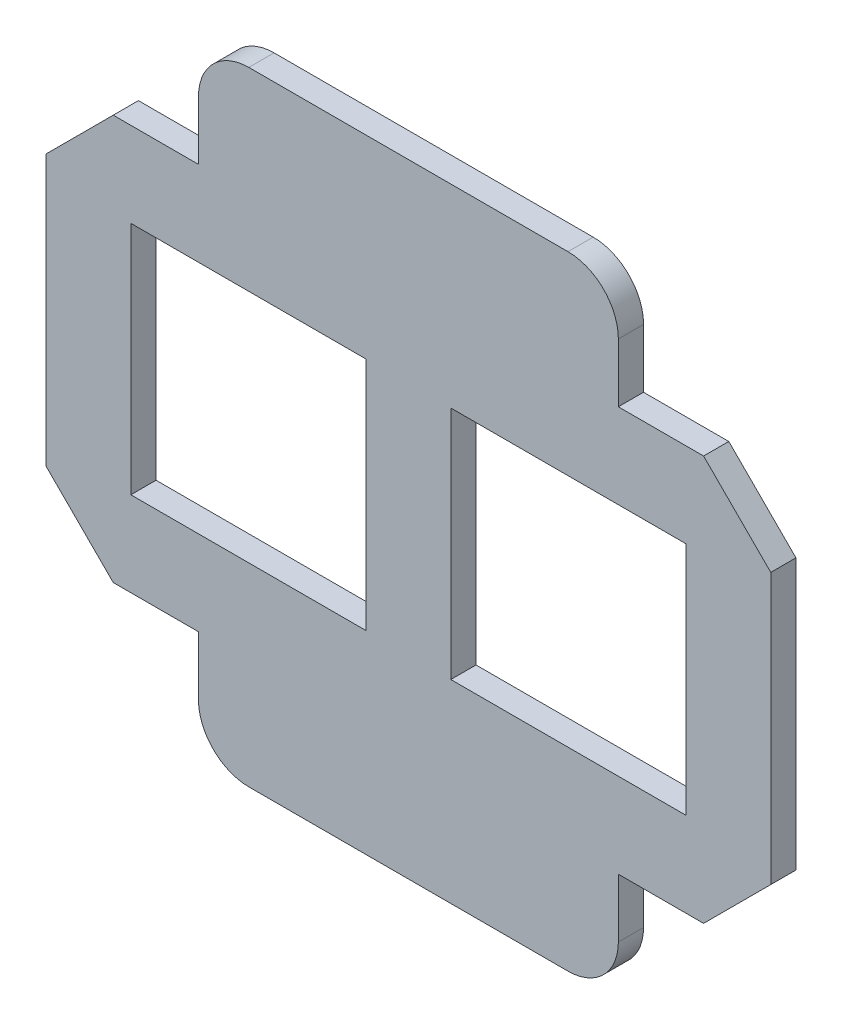
ISO-10303-21;
HEADER;
FILE_DESCRIPTION(('STEP AP214'),'2;1');
FILE_NAME('part.step','',(''),(''),'','','');
FILE_SCHEMA(('AUTOMOTIVE_DESIGN { 1 0 10303 214 1 1 1 1 }'));
ENDSEC;
DATA;
#1=APPLICATION_CONTEXT('core data for automotive mechanical design processes');
#2=APPLICATION_PROTOCOL_DEFINITION('international standard','automotive_design',2000,#1);
#3=PRODUCT_CONTEXT('',#1,'mechanical');
#4=PRODUCT('Part','Part','',(#3));
#5=PRODUCT_RELATED_PRODUCT_CATEGORY('part','',(#4));
#6=PRODUCT_DEFINITION_FORMATION('','',#4);
#7=PRODUCT_DEFINITION_CONTEXT('part definition',#1,'design');
#8=PRODUCT_DEFINITION('design','',#6,#7);
#9=PRODUCT_DEFINITION_SHAPE('','',#8);
#10=(LENGTH_UNIT() NAMED_UNIT(*) SI_UNIT(.MILLI.,.METRE.));
#11=(NAMED_UNIT(*) PLANE_ANGLE_UNIT() SI_UNIT($,.RADIAN.));
#12=(NAMED_UNIT(*) SI_UNIT($,.STERADIAN.) SOLID_ANGLE_UNIT());
#13=UNCERTAINTY_MEASURE_WITH_UNIT(LENGTH_MEASURE(1.E-05),#10,'distance_accuracy_value','');
#14=(GEOMETRIC_REPRESENTATION_CONTEXT(3) GLOBAL_UNCERTAINTY_ASSIGNED_CONTEXT((#13)) GLOBAL_UNIT_ASSIGNED_CONTEXT((#10,
#11,#12)) REPRESENTATION_CONTEXT('',''));
#15=CARTESIAN_POINT('',(0.,0.,0.));
#16=DIRECTION('',(0.,0.,1.));
#17=DIRECTION('',(1.,0.,0.));
#18=AXIS2_PLACEMENT_3D('',#15,#16,#17);
#19=CARTESIAN_POINT('',(14.,0.,1.5));
#20=DIRECTION('',(-1.,0.,0.));
#21=DIRECTION('',(0.,0.,1.));
#22=AXIS2_PLACEMENT_3D('',#19,#20,#21);
#23=PLANE('',#22);
#24=DIRECTION('',(0.,1.,0.));
#25=VECTOR('',#24,1.);
#26=CARTESIAN_POINT('',(14.,0.,0.));
#27=LINE('',#26,#25);
#28=CARTESIAN_POINT('',(14.,0.,0.));
#29=VERTEX_POINT('',#28);
#30=CARTESIAN_POINT('',(14.,14.,0.));
#31=VERTEX_POINT('',#30);
#32=EDGE_CURVE('E336',#29,#31,#27,.T.);
#33=ORIENTED_EDGE('',*,*,#32,.F.);
#34=DIRECTION('',(0.,0.,-1.));
#35=VECTOR('',#34,1.);
#36=CARTESIAN_POINT('',(14.,0.,1.5));
#37=LINE('',#36,#35);
#38=CARTESIAN_POINT('',(14.,0.,1.5));
#39=VERTEX_POINT('',#38);
#40=EDGE_CURVE('E356',#39,#29,#37,.T.);
#41=ORIENTED_EDGE('',*,*,#40,.F.);
#42=DIRECTION('',(0.,1.,0.));
#43=VECTOR('',#42,1.);
#44=CARTESIAN_POINT('',(14.,0.,1.5));
#45=LINE('',#44,#43);
#46=CARTESIAN_POINT('',(14.,14.,1.5));
#47=VERTEX_POINT('',#46);
#48=EDGE_CURVE('E286',#39,#47,#45,.T.);
#49=ORIENTED_EDGE('',*,*,#48,.T.);
#50=DIRECTION('',(0.,0.,-1.));
#51=VECTOR('',#50,1.);
#52=CARTESIAN_POINT('',(14.,14.,1.5));
#53=LINE('',#52,#51);
#54=EDGE_CURVE('E348',#47,#31,#53,.T.);
#55=ORIENTED_EDGE('',*,*,#54,.T.);
#56=EDGE_LOOP('',(#33,#41,#49,#55));
#57=FACE_BOUND('',#56,.T.);
#58=ADVANCED_FACE('F37',(#57),#23,.T.);
#59=CARTESIAN_POINT('',(0.,0.,1.5));
#60=DIRECTION('',(0.,1.,0.));
#61=DIRECTION('',(0.,0.,1.));
#62=AXIS2_PLACEMENT_3D('',#59,#60,#61);
#63=PLANE('',#62);
#64=DIRECTION('',(1.,0.,0.));
#65=VECTOR('',#64,1.);
#66=CARTESIAN_POINT('',(0.,0.,0.));
#67=LINE('',#66,#65);
#68=CARTESIAN_POINT('',(0.,0.,0.));
#69=VERTEX_POINT('',#68);
#70=EDGE_CURVE('E339',#69,#29,#67,.T.);
#71=ORIENTED_EDGE('',*,*,#70,.F.);
#72=DIRECTION('',(0.,0.,-1.));
#73=VECTOR('',#72,1.);
#74=CARTESIAN_POINT('',(0.,0.,1.5));
#75=LINE('',#74,#73);
#76=CARTESIAN_POINT('',(0.,0.,1.5));
#77=VERTEX_POINT('',#76);
#78=EDGE_CURVE('E354',#77,#69,#75,.T.);
#79=ORIENTED_EDGE('',*,*,#78,.F.);
#80=DIRECTION('',(1.,0.,0.));
#81=VECTOR('',#80,1.);
#82=CARTESIAN_POINT('',(0.,0.,1.5));
#83=LINE('',#82,#81);
#84=EDGE_CURVE('E289',#77,#39,#83,.T.);
#85=ORIENTED_EDGE('',*,*,#84,.T.);
#86=ORIENTED_EDGE('',*,*,#40,.T.);
#87=EDGE_LOOP('',(#71,#79,#85,#86));
#88=FACE_BOUND('',#87,.T.);
#89=ADVANCED_FACE('F518',(#88),#63,.T.);
#90=CARTESIAN_POINT('',(0.,0.,1.5));
#91=DIRECTION('',(-1.,0.,0.));
#92=DIRECTION('',(0.,0.,1.));
#93=AXIS2_PLACEMENT_3D('',#90,#91,#92);
#94=PLANE('',#93);
#95=DIRECTION('',(0.,1.,0.));
#96=VECTOR('',#95,1.);
#97=CARTESIAN_POINT('',(0.,0.,0.));
#98=LINE('',#97,#96);
#99=CARTESIAN_POINT('',(0.,14.,0.));
#100=VERTEX_POINT('',#99);
#101=EDGE_CURVE('E342',#69,#100,#98,.T.);
#102=ORIENTED_EDGE('',*,*,#101,.T.);
#103=DIRECTION('',(0.,0.,-1.));
#104=VECTOR('',#103,1.);
#105=CARTESIAN_POINT('',(0.,14.,1.5));
#106=LINE('',#105,#104);
#107=CARTESIAN_POINT('',(0.,14.,1.5));
#108=VERTEX_POINT('',#107);
#109=EDGE_CURVE('E350',#108,#100,#106,.T.);
#110=ORIENTED_EDGE('',*,*,#109,.F.);
#111=DIRECTION('',(0.,1.,0.));
#112=VECTOR('',#111,1.);
#113=CARTESIAN_POINT('',(0.,0.,1.5));
#114=LINE('',#113,#112);
#115=EDGE_CURVE('E292',#77,#108,#114,.T.);
#116=ORIENTED_EDGE('',*,*,#115,.F.);
#117=ORIENTED_EDGE('',*,*,#78,.T.);
#118=EDGE_LOOP('',(#102,#110,#116,#117));
#119=FACE_BOUND('',#118,.T.);
#120=ADVANCED_FACE('F524',(#119),#94,.F.);
#121=CARTESIAN_POINT('',(33.05,0.,1.5));
#122=DIRECTION('',(-1.,0.,0.));
#123=DIRECTION('',(0.,0.,1.));
#124=AXIS2_PLACEMENT_3D('',#121,#122,#123);
#125=PLANE('',#124);
#126=DIRECTION('',(0.,1.,0.));
#127=VECTOR('',#126,1.);
#128=CARTESIAN_POINT('',(33.05,0.,0.));
#129=LINE('',#128,#127);
#130=CARTESIAN_POINT('',(33.05,0.,0.));
#131=VERTEX_POINT('',#130);
#132=CARTESIAN_POINT('',(33.05,14.,0.));
#133=VERTEX_POINT('',#132);
#134=EDGE_CURVE('E324',#131,#133,#129,.T.);
#135=ORIENTED_EDGE('',*,*,#134,.F.);
#136=DIRECTION('',(0.,0.,-1.));
#137=VECTOR('',#136,1.);
#138=CARTESIAN_POINT('',(33.05,0.,1.5));
#139=LINE('',#138,#137);
#140=CARTESIAN_POINT('',(33.05,0.,1.5));
#141=VERTEX_POINT('',#140);
#142=EDGE_CURVE('E351',#141,#131,#139,.T.);
#143=ORIENTED_EDGE('',*,*,#142,.F.);
#144=DIRECTION('',(0.,1.,0.));
#145=VECTOR('',#144,1.);
#146=CARTESIAN_POINT('',(33.05,0.,1.5));
#147=LINE('',#146,#145);
#148=CARTESIAN_POINT('',(33.05,14.,1.5));
#149=VERTEX_POINT('',#148);
#150=EDGE_CURVE('E275',#141,#149,#147,.T.);
#151=ORIENTED_EDGE('',*,*,#150,.T.);
#152=DIRECTION('',(0.,0.,-1.));
#153=VECTOR('',#152,1.);
#154=CARTESIAN_POINT('',(33.05,14.,1.5));
#155=LINE('',#154,#153);
#156=EDGE_CURVE('E243',#149,#133,#155,.T.);
#157=ORIENTED_EDGE('',*,*,#156,.T.);
#158=EDGE_LOOP('',(#135,#143,#151,#157));
#159=FACE_BOUND('',#158,.T.);
#160=ADVANCED_FACE('F542',(#159),#125,.T.);
#161=CARTESIAN_POINT('',(0.,0.,1.5));
#162=DIRECTION('',(0.,1.,0.));
#163=DIRECTION('',(0.,0.,1.));
#164=AXIS2_PLACEMENT_3D('',#161,#162,#163);
#165=PLANE('',#164);
#166=DIRECTION('',(1.,0.,0.));
#167=VECTOR('',#166,1.);
#168=CARTESIAN_POINT('',(0.,0.,0.));
#169=LINE('',#168,#167);
#170=CARTESIAN_POINT('',(19.05,0.,0.));
#171=VERTEX_POINT('',#170);
#172=EDGE_CURVE('E327',#171,#131,#169,.T.);
#173=ORIENTED_EDGE('',*,*,#172,.F.);
#174=DIRECTION('',(0.,0.,-1.));
#175=VECTOR('',#174,1.);
#176=CARTESIAN_POINT('',(19.05,0.,1.5));
#177=LINE('',#176,#175);
#178=CARTESIAN_POINT('',(19.05,0.,1.5));
#179=VERTEX_POINT('',#178);
#180=EDGE_CURVE('E363',#179,#171,#177,.T.);
#181=ORIENTED_EDGE('',*,*,#180,.F.);
#182=DIRECTION('',(1.,0.,0.));
#183=VECTOR('',#182,1.);
#184=CARTESIAN_POINT('',(0.,0.,1.5));
#185=LINE('',#184,#183);
#186=EDGE_CURVE('E278',#179,#141,#185,.T.);
#187=ORIENTED_EDGE('',*,*,#186,.T.);
#188=ORIENTED_EDGE('',*,*,#142,.T.);
#189=EDGE_LOOP('',(#173,#181,#187,#188));
#190=FACE_BOUND('',#189,.T.);
#191=ADVANCED_FACE('F538',(#190),#165,.T.);
#192=CARTESIAN_POINT('',(19.05,0.,1.5));
#193=DIRECTION('',(-1.,0.,0.));
#194=DIRECTION('',(0.,0.,1.));
#195=AXIS2_PLACEMENT_3D('',#192,#193,#194);
#196=PLANE('',#195);
#197=DIRECTION('',(0.,1.,0.));
#198=VECTOR('',#197,1.);
#199=CARTESIAN_POINT('',(19.05,0.,0.));
#200=LINE('',#199,#198);
#201=CARTESIAN_POINT('',(19.05,14.,0.));
#202=VERTEX_POINT('',#201);
#203=EDGE_CURVE('E330',#171,#202,#200,.T.);
#204=ORIENTED_EDGE('',*,*,#203,.T.);
#205=DIRECTION('',(0.,0.,-1.));
#206=VECTOR('',#205,1.);
#207=CARTESIAN_POINT('',(19.05,14.,1.5));
#208=LINE('',#207,#206);
#209=CARTESIAN_POINT('',(19.05,14.,1.5));
#210=VERTEX_POINT('',#209);
#211=EDGE_CURVE('E360',#210,#202,#208,.T.);
#212=ORIENTED_EDGE('',*,*,#211,.F.);
#213=DIRECTION('',(0.,1.,0.));
#214=VECTOR('',#213,1.);
#215=CARTESIAN_POINT('',(19.05,0.,1.5));
#216=LINE('',#215,#214);
#217=EDGE_CURVE('E281',#179,#210,#216,.T.);
#218=ORIENTED_EDGE('',*,*,#217,.F.);
#219=ORIENTED_EDGE('',*,*,#180,.T.);
#220=EDGE_LOOP('',(#204,#212,#218,#219));
#221=FACE_BOUND('',#220,.T.);
#222=ADVANCED_FACE('F534',(#221),#196,.F.);
#223=CARTESIAN_POINT('',(29.025,0.,1.5));
#224=DIRECTION('',(1.,0.,0.));
#225=DIRECTION('',(0.,0.,-1.));
#226=AXIS2_PLACEMENT_3D('',#223,#224,#225);
#227=PLANE('',#226);
#228=DIRECTION('',(0.,-1.,0.));
#229=VECTOR('',#228,1.);
#230=CARTESIAN_POINT('',(29.025,0.,0.));
#231=LINE('',#230,#229);
#232=CARTESIAN_POINT('',(29.025,22.55,0.));
#233=VERTEX_POINT('',#232);
#234=CARTESIAN_POINT('',(29.025,19.05,0.));
#235=VERTEX_POINT('',#234);
#236=EDGE_CURVE('E298',#233,#235,#231,.T.);
#237=ORIENTED_EDGE('',*,*,#236,.F.);
#238=DIRECTION('',(0.,0.,-1.));
#239=VECTOR('',#238,1.);
#240=CARTESIAN_POINT('',(29.025,22.55,1.5));
#241=LINE('',#240,#239);
#242=CARTESIAN_POINT('',(29.025,22.55,1.5));
#243=VERTEX_POINT('',#242);
#244=EDGE_CURVE('E401',#233,#243,#241,.F.);
#245=ORIENTED_EDGE('',*,*,#244,.T.);
#246=DIRECTION('',(0.,-1.,0.));
#247=VECTOR('',#246,1.);
#248=CARTESIAN_POINT('',(29.025,0.,1.5));
#249=LINE('',#248,#247);
#250=CARTESIAN_POINT('',(29.025,19.05,1.5));
#251=VERTEX_POINT('',#250);
#252=EDGE_CURVE('E255',#243,#251,#249,.T.);
#253=ORIENTED_EDGE('',*,*,#252,.T.);
#254=DIRECTION('',(0.,0.,-1.));
#255=VECTOR('',#254,1.);
#256=CARTESIAN_POINT('',(29.025,19.05,1.5));
#257=LINE('',#256,#255);
#258=EDGE_CURVE('E297',#251,#235,#257,.T.);
#259=ORIENTED_EDGE('',*,*,#258,.T.);
#260=EDGE_LOOP('',(#237,#245,#253,#259));
#261=FACE_BOUND('',#260,.T.);
#262=ADVANCED_FACE('F537',(#261),#227,.T.);
#263=CARTESIAN_POINT('',(0.,25.55,1.5));
#264=DIRECTION('',(0.,1.,0.));
#265=DIRECTION('',(0.,0.,1.));
#266=AXIS2_PLACEMENT_3D('',#263,#264,#265);
#267=PLANE('',#266);
#268=DIRECTION('',(1.,0.,0.));
#269=VECTOR('',#268,1.);
#270=CARTESIAN_POINT('',(0.,25.55,1.5));
#271=LINE('',#270,#269);
#272=CARTESIAN_POINT('',(7.025,25.55,1.5));
#273=VERTEX_POINT('',#272);
#274=CARTESIAN_POINT('',(26.025,25.55,1.5));
#275=VERTEX_POINT('',#274);
#276=EDGE_CURVE('E252',#273,#275,#271,.T.);
#277=ORIENTED_EDGE('',*,*,#276,.T.);
#278=DIRECTION('',(0.,0.,-1.));
#279=VECTOR('',#278,1.);
#280=CARTESIAN_POINT('',(26.025,25.55,1.5));
#281=LINE('',#280,#279);
#282=CARTESIAN_POINT('',(26.025,25.55,0.));
#283=VERTEX_POINT('',#282);
#284=EDGE_CURVE('E398',#275,#283,#281,.T.);
#285=ORIENTED_EDGE('',*,*,#284,.T.);
#286=DIRECTION('',(1.,0.,0.));
#287=VECTOR('',#286,1.);
#288=CARTESIAN_POINT('',(0.,25.55,0.));
#289=LINE('',#288,#287);
#290=CARTESIAN_POINT('',(7.025,25.55,0.));
#291=VERTEX_POINT('',#290);
#292=EDGE_CURVE('E300',#291,#283,#289,.T.);
#293=ORIENTED_EDGE('',*,*,#292,.F.);
#294=DIRECTION('',(0.,0.,-1.));
#295=VECTOR('',#294,1.);
#296=CARTESIAN_POINT('',(7.025,25.55,1.5));
#297=LINE('',#296,#295);
#298=EDGE_CURVE('E396',#291,#273,#297,.F.);
#299=ORIENTED_EDGE('',*,*,#298,.T.);
#300=EDGE_LOOP('',(#277,#285,#293,#299));
#301=FACE_BOUND('',#300,.T.);
#302=ADVANCED_FACE('F504',(#301),#267,.T.);
#303=CARTESIAN_POINT('',(4.025,0.,1.5));
#304=DIRECTION('',(-1.,0.,0.));
#305=DIRECTION('',(0.,0.,1.));
#306=AXIS2_PLACEMENT_3D('',#303,#304,#305);
#307=PLANE('',#306);
#308=DIRECTION('',(0.,1.,0.));
#309=VECTOR('',#308,1.);
#310=CARTESIAN_POINT('',(4.025,0.,1.5));
#311=LINE('',#310,#309);
#312=CARTESIAN_POINT('',(4.025,19.05,1.5));
#313=VERTEX_POINT('',#312);
#314=CARTESIAN_POINT('',(4.025,22.55,1.5));
#315=VERTEX_POINT('',#314);
#316=EDGE_CURVE('E233',#313,#315,#311,.T.);
#317=ORIENTED_EDGE('',*,*,#316,.T.);
#318=DIRECTION('',(0.,0.,-1.));
#319=VECTOR('',#318,1.);
#320=CARTESIAN_POINT('',(4.025,22.55,1.5));
#321=LINE('',#320,#319);
#322=CARTESIAN_POINT('',(4.025,22.55,0.));
#323=VERTEX_POINT('',#322);
#324=EDGE_CURVE('E403',#315,#323,#321,.T.);
#325=ORIENTED_EDGE('',*,*,#324,.T.);
#326=DIRECTION('',(0.,1.,0.));
#327=VECTOR('',#326,1.);
#328=CARTESIAN_POINT('',(4.025,0.,0.));
#329=LINE('',#328,#327);
#330=CARTESIAN_POINT('',(4.025,19.05,0.));
#331=VERTEX_POINT('',#330);
#332=EDGE_CURVE('E242',#331,#323,#329,.T.);
#333=ORIENTED_EDGE('',*,*,#332,.F.);
#334=DIRECTION('',(0.,0.,-1.));
#335=VECTOR('',#334,1.);
#336=CARTESIAN_POINT('',(4.025,19.05,1.5));
#337=LINE('',#336,#335);
#338=EDGE_CURVE('E227',#313,#331,#337,.T.);
#339=ORIENTED_EDGE('',*,*,#338,.F.);
#340=EDGE_LOOP('',(#317,#325,#333,#339));
#341=FACE_BOUND('',#340,.T.);
#342=ADVANCED_FACE('F238',(#341),#307,.T.);
#343=CARTESIAN_POINT('',(0.,19.05,1.5));
#344=DIRECTION('',(0.,1.,0.));
#345=DIRECTION('',(0.,0.,1.));
#346=AXIS2_PLACEMENT_3D('',#343,#344,#345);
#347=PLANE('',#346);
#348=DIRECTION('',(1.,0.,0.));
#349=VECTOR('',#348,1.);
#350=CARTESIAN_POINT('',(0.,19.05,0.));
#351=LINE('',#350,#349);
#352=CARTESIAN_POINT('',(-1.04999999999999,19.05,0.));
#353=VERTEX_POINT('',#352);
#354=EDGE_CURVE('E304',#353,#331,#351,.T.);
#355=ORIENTED_EDGE('',*,*,#354,.F.);
#356=DIRECTION('',(0.,0.,1.));
#357=VECTOR('',#356,1.);
#358=CARTESIAN_POINT('',(-1.04999999999999,19.05,1.5));
#359=LINE('',#358,#357);
#360=CARTESIAN_POINT('',(-1.04999999999999,19.05,1.5));
#361=VERTEX_POINT('',#360);
#362=EDGE_CURVE('E11',#353,#361,#359,.T.);
#363=ORIENTED_EDGE('',*,*,#362,.T.);
#364=DIRECTION('',(1.,0.,0.));
#365=VECTOR('',#364,1.);
#366=CARTESIAN_POINT('',(0.,19.05,1.5));
#367=LINE('',#366,#365);
#368=EDGE_CURVE('E223',#361,#313,#367,.T.);
#369=ORIENTED_EDGE('',*,*,#368,.T.);
#370=ORIENTED_EDGE('',*,*,#338,.T.);
#371=EDGE_LOOP('',(#355,#363,#369,#370));
#372=FACE_BOUND('',#371,.T.);
#373=ADVANCED_FACE('F226',(#372),#347,.T.);
#374=CARTESIAN_POINT('',(-5.05,0.,1.5));
#375=DIRECTION('',(1.,0.,0.));
#376=DIRECTION('',(0.,1.,0.));
#377=AXIS2_PLACEMENT_3D('',#374,#375,#376);
#378=PLANE('',#377);
#379=DIRECTION('',(0.,-1.,0.));
#380=VECTOR('',#379,1.);
#381=CARTESIAN_POINT('',(-5.05,0.,0.));
#382=LINE('',#381,#380);
#383=CARTESIAN_POINT('',(-5.05,15.05,0.));
#384=VERTEX_POINT('',#383);
#385=CARTESIAN_POINT('',(-5.05,-1.04999999999999,0.));
#386=VERTEX_POINT('',#385);
#387=EDGE_CURVE('E306',#384,#386,#382,.T.);
#388=ORIENTED_EDGE('',*,*,#387,.T.);
#389=DIRECTION('',(0.,0.,1.));
#390=VECTOR('',#389,1.);
#391=CARTESIAN_POINT('',(-5.05,-1.04999999999999,1.5));
#392=LINE('',#391,#390);
#393=CARTESIAN_POINT('',(-5.05,-1.04999999999999,1.5));
#394=VERTEX_POINT('',#393);
#395=EDGE_CURVE('E46',#386,#394,#392,.T.);
#396=ORIENTED_EDGE('',*,*,#395,.T.);
#397=DIRECTION('',(0.,-1.,0.));
#398=VECTOR('',#397,1.);
#399=CARTESIAN_POINT('',(-5.05,0.,1.5));
#400=LINE('',#399,#398);
#401=CARTESIAN_POINT('',(-5.05,15.05,1.5));
#402=VERTEX_POINT('',#401);
#403=EDGE_CURVE('E232',#402,#394,#400,.T.);
#404=ORIENTED_EDGE('',*,*,#403,.F.);
#405=DIRECTION('',(0.,0.,-1.));
#406=VECTOR('',#405,1.);
#407=CARTESIAN_POINT('',(-5.05,15.05,0.));
#408=LINE('',#407,#406);
#409=EDGE_CURVE('E433',#402,#384,#408,.T.);
#410=ORIENTED_EDGE('',*,*,#409,.T.);
#411=EDGE_LOOP('',(#388,#396,#404,#410));
#412=FACE_BOUND('',#411,.T.);
#413=ADVANCED_FACE('F437',(#412),#378,.F.);
#414=CARTESIAN_POINT('',(0.,-5.05,1.5));
#415=DIRECTION('',(0.,1.,0.));
#416=DIRECTION('',(0.,0.,1.));
#417=AXIS2_PLACEMENT_3D('',#414,#415,#416);
#418=PLANE('',#417);
#419=DIRECTION('',(1.,0.,0.));
#420=VECTOR('',#419,1.);
#421=CARTESIAN_POINT('',(0.,-5.05,1.5));
#422=LINE('',#421,#420);
#423=CARTESIAN_POINT('',(-1.05,-5.05,1.5));
#424=VERTEX_POINT('',#423);
#425=CARTESIAN_POINT('',(4.025,-5.05,1.5));
#426=VERTEX_POINT('',#425);
#427=EDGE_CURVE('E260',#424,#426,#422,.T.);
#428=ORIENTED_EDGE('',*,*,#427,.F.);
#429=DIRECTION('',(0.,0.,-1.));
#430=VECTOR('',#429,1.);
#431=CARTESIAN_POINT('',(-1.05,-5.05,1.5));
#432=LINE('',#431,#430);
#433=CARTESIAN_POINT('',(-1.05,-5.05,0.));
#434=VERTEX_POINT('',#433);
#435=EDGE_CURVE('E430',#424,#434,#432,.T.);
#436=ORIENTED_EDGE('',*,*,#435,.T.);
#437=DIRECTION('',(1.,0.,0.));
#438=VECTOR('',#437,1.);
#439=CARTESIAN_POINT('',(0.,-5.05,0.));
#440=LINE('',#439,#438);
#441=CARTESIAN_POINT('',(4.025,-5.05,0.));
#442=VERTEX_POINT('',#441);
#443=EDGE_CURVE('E309',#434,#442,#440,.T.);
#444=ORIENTED_EDGE('',*,*,#443,.T.);
#445=DIRECTION('',(0.,0.,-1.));
#446=VECTOR('',#445,1.);
#447=CARTESIAN_POINT('',(4.025,-5.05,1.5));
#448=LINE('',#447,#446);
#449=EDGE_CURVE('E244',#426,#442,#448,.T.);
#450=ORIENTED_EDGE('',*,*,#449,.F.);
#451=EDGE_LOOP('',(#428,#436,#444,#450));
#452=FACE_BOUND('',#451,.T.);
#453=ADVANCED_FACE('F448',(#452),#418,.F.);
#454=CARTESIAN_POINT('',(4.025,0.,1.5));
#455=DIRECTION('',(1.,0.,0.));
#456=DIRECTION('',(0.,1.,0.));
#457=AXIS2_PLACEMENT_3D('',#454,#455,#456);
#458=PLANE('',#457);
#459=DIRECTION('',(0.,-1.,0.));
#460=VECTOR('',#459,1.);
#461=CARTESIAN_POINT('',(4.025,0.,0.));
#462=LINE('',#461,#460);
#463=CARTESIAN_POINT('',(4.025,-8.55,0.));
#464=VERTEX_POINT('',#463);
#465=EDGE_CURVE('E311',#442,#464,#462,.T.);
#466=ORIENTED_EDGE('',*,*,#465,.T.);
#467=DIRECTION('',(0.,0.,-1.));
#468=VECTOR('',#467,1.);
#469=CARTESIAN_POINT('',(4.025,-8.55,1.5));
#470=LINE('',#469,#468);
#471=CARTESIAN_POINT('',(4.025,-8.55,1.5));
#472=VERTEX_POINT('',#471);
#473=EDGE_CURVE('E384',#464,#472,#470,.F.);
#474=ORIENTED_EDGE('',*,*,#473,.T.);
#475=DIRECTION('',(0.,-1.,0.));
#476=VECTOR('',#475,1.);
#477=CARTESIAN_POINT('',(4.025,0.,1.5));
#478=LINE('',#477,#476);
#479=EDGE_CURVE('E262',#426,#472,#478,.T.);
#480=ORIENTED_EDGE('',*,*,#479,.F.);
#481=ORIENTED_EDGE('',*,*,#449,.T.);
#482=EDGE_LOOP('',(#466,#474,#480,#481));
#483=FACE_BOUND('',#482,.T.);
#484=ADVANCED_FACE('F559',(#483),#458,.F.);
#485=CARTESIAN_POINT('',(0.,-11.55,1.5));
#486=DIRECTION('',(0.,1.,0.));
#487=DIRECTION('',(0.,0.,1.));
#488=AXIS2_PLACEMENT_3D('',#485,#486,#487);
#489=PLANE('',#488);
#490=DIRECTION('',(1.,0.,0.));
#491=VECTOR('',#490,1.);
#492=CARTESIAN_POINT('',(0.,-11.55,1.5));
#493=LINE('',#492,#491);
#494=CARTESIAN_POINT('',(7.025,-11.55,1.5));
#495=VERTEX_POINT('',#494);
#496=CARTESIAN_POINT('',(26.025,-11.55,1.5));
#497=VERTEX_POINT('',#496);
#498=EDGE_CURVE('E266',#495,#497,#493,.T.);
#499=ORIENTED_EDGE('',*,*,#498,.F.);
#500=DIRECTION('',(0.,0.,-1.));
#501=VECTOR('',#500,1.);
#502=CARTESIAN_POINT('',(7.025,-11.55,1.5));
#503=LINE('',#502,#501);
#504=CARTESIAN_POINT('',(7.025,-11.55,0.));
#505=VERTEX_POINT('',#504);
#506=EDGE_CURVE('E373',#495,#505,#503,.T.);
#507=ORIENTED_EDGE('',*,*,#506,.T.);
#508=DIRECTION('',(1.,0.,0.));
#509=VECTOR('',#508,1.);
#510=CARTESIAN_POINT('',(0.,-11.55,0.));
#511=LINE('',#510,#509);
#512=CARTESIAN_POINT('',(26.025,-11.55,0.));
#513=VERTEX_POINT('',#512);
#514=EDGE_CURVE('E315',#505,#513,#511,.T.);
#515=ORIENTED_EDGE('',*,*,#514,.T.);
#516=DIRECTION('',(0.,0.,-1.));
#517=VECTOR('',#516,1.);
#518=CARTESIAN_POINT('',(26.025,-11.55,1.5));
#519=LINE('',#518,#517);
#520=EDGE_CURVE('E358',#513,#497,#519,.F.);
#521=ORIENTED_EDGE('',*,*,#520,.T.);
#522=EDGE_LOOP('',(#499,#507,#515,#521));
#523=FACE_BOUND('',#522,.T.);
#524=ADVANCED_FACE('F460',(#523),#489,.F.);
#525=CARTESIAN_POINT('',(29.025,0.,1.5));
#526=DIRECTION('',(1.,0.,0.));
#527=DIRECTION('',(0.,0.,-1.));
#528=AXIS2_PLACEMENT_3D('',#525,#526,#527);
#529=PLANE('',#528);
#530=DIRECTION('',(0.,-1.,0.));
#531=VECTOR('',#530,1.);
#532=CARTESIAN_POINT('',(29.025,0.,1.5));
#533=LINE('',#532,#531);
#534=CARTESIAN_POINT('',(29.025,-5.05,1.5));
#535=VERTEX_POINT('',#534);
#536=CARTESIAN_POINT('',(29.025,-8.55,1.5));
#537=VERTEX_POINT('',#536);
#538=EDGE_CURVE('E269',#535,#537,#533,.T.);
#539=ORIENTED_EDGE('',*,*,#538,.T.);
#540=DIRECTION('',(0.,0.,-1.));
#541=VECTOR('',#540,1.);
#542=CARTESIAN_POINT('',(29.025,-8.55,0.));
#543=LINE('',#542,#541);
#544=CARTESIAN_POINT('',(29.025,-8.55,0.));
#545=VERTEX_POINT('',#544);
#546=EDGE_CURVE('E393',#537,#545,#543,.T.);
#547=ORIENTED_EDGE('',*,*,#546,.T.);
#548=DIRECTION('',(0.,-1.,0.));
#549=VECTOR('',#548,1.);
#550=CARTESIAN_POINT('',(29.025,0.,0.));
#551=LINE('',#550,#549);
#552=CARTESIAN_POINT('',(29.025,-5.05,0.));
#553=VERTEX_POINT('',#552);
#554=EDGE_CURVE('E318',#553,#545,#551,.T.);
#555=ORIENTED_EDGE('',*,*,#554,.F.);
#556=DIRECTION('',(0.,0.,-1.));
#557=VECTOR('',#556,1.);
#558=CARTESIAN_POINT('',(29.025,-5.05,1.5));
#559=LINE('',#558,#557);
#560=EDGE_CURVE('E368',#535,#553,#559,.T.);
#561=ORIENTED_EDGE('',*,*,#560,.F.);
#562=EDGE_LOOP('',(#539,#547,#555,#561));
#563=FACE_BOUND('',#562,.T.);
#564=ADVANCED_FACE('F469',(#563),#529,.T.);
#565=CARTESIAN_POINT('',(34.1,-5.05,0.));
#566=VERTEX_POINT('',#565);
#567=EDGE_CURVE('E312',#553,#566,#440,.T.);
#568=ORIENTED_EDGE('',*,*,#567,.T.);
#569=DIRECTION('',(0.,0.,1.));
#570=VECTOR('',#569,1.);
#571=CARTESIAN_POINT('',(34.1,-5.05,1.5));
#572=LINE('',#571,#570);
#573=CARTESIAN_POINT('',(34.1,-5.05,1.5));
#574=VERTEX_POINT('',#573);
#575=EDGE_CURVE('E418',#566,#574,#572,.T.);
#576=ORIENTED_EDGE('',*,*,#575,.T.);
#577=EDGE_CURVE('E263',#535,#574,#422,.T.);
#578=ORIENTED_EDGE('',*,*,#577,.F.);
#579=ORIENTED_EDGE('',*,*,#560,.T.);
#580=EDGE_LOOP('',(#568,#576,#578,#579));
#581=FACE_BOUND('',#580,.T.);
#582=ADVANCED_FACE('F552',(#581),#418,.F.);
#583=CARTESIAN_POINT('',(38.1,0.,1.5));
#584=DIRECTION('',(1.,0.,0.));
#585=DIRECTION('',(0.,1.,0.));
#586=AXIS2_PLACEMENT_3D('',#583,#584,#585);
#587=PLANE('',#586);
#588=DIRECTION('',(0.,-1.,0.));
#589=VECTOR('',#588,1.);
#590=CARTESIAN_POINT('',(38.1,0.,1.5));
#591=LINE('',#590,#589);
#592=CARTESIAN_POINT('',(38.1,15.05,1.5));
#593=VERTEX_POINT('',#592);
#594=CARTESIAN_POINT('',(38.1,-1.05,1.5));
#595=VERTEX_POINT('',#594);
#596=EDGE_CURVE('E272',#593,#595,#591,.T.);
#597=ORIENTED_EDGE('',*,*,#596,.T.);
#598=DIRECTION('',(0.,0.,-1.));
#599=VECTOR('',#598,1.);
#600=CARTESIAN_POINT('',(38.1,-1.05,0.));
#601=LINE('',#600,#599);
#602=CARTESIAN_POINT('',(38.1,-1.05,0.));
#603=VERTEX_POINT('',#602);
#604=EDGE_CURVE('E407',#595,#603,#601,.T.);
#605=ORIENTED_EDGE('',*,*,#604,.T.);
#606=DIRECTION('',(0.,-1.,0.));
#607=VECTOR('',#606,1.);
#608=CARTESIAN_POINT('',(38.1,0.,0.));
#609=LINE('',#608,#607);
#610=CARTESIAN_POINT('',(38.1,15.05,0.));
#611=VERTEX_POINT('',#610);
#612=EDGE_CURVE('E321',#611,#603,#609,.T.);
#613=ORIENTED_EDGE('',*,*,#612,.F.);
#614=DIRECTION('',(0.,0.,1.));
#615=VECTOR('',#614,1.);
#616=CARTESIAN_POINT('',(38.1,15.05,1.5));
#617=LINE('',#616,#615);
#618=EDGE_CURVE('E405',#611,#593,#617,.T.);
#619=ORIENTED_EDGE('',*,*,#618,.T.);
#620=EDGE_LOOP('',(#597,#605,#613,#619));
#621=FACE_BOUND('',#620,.T.);
#622=ADVANCED_FACE('F481',(#621),#587,.T.);
#623=CARTESIAN_POINT('',(0.,14.,1.5));
#624=DIRECTION('',(0.,1.,0.));
#625=DIRECTION('',(0.,0.,1.));
#626=AXIS2_PLACEMENT_3D('',#623,#624,#625);
#627=PLANE('',#626);
#628=DIRECTION('',(1.,0.,0.));
#629=VECTOR('',#628,1.);
#630=CARTESIAN_POINT('',(0.,14.,0.));
#631=LINE('',#630,#629);
#632=EDGE_CURVE('E333',#202,#133,#631,.T.);
#633=ORIENTED_EDGE('',*,*,#632,.T.);
#634=ORIENTED_EDGE('',*,*,#156,.F.);
#635=DIRECTION('',(1.,0.,0.));
#636=VECTOR('',#635,1.);
#637=CARTESIAN_POINT('',(0.,14.,1.5));
#638=LINE('',#637,#636);
#639=EDGE_CURVE('E284',#210,#149,#638,.T.);
#640=ORIENTED_EDGE('',*,*,#639,.F.);
#641=ORIENTED_EDGE('',*,*,#211,.T.);
#642=EDGE_LOOP('',(#633,#634,#640,#641));
#643=FACE_BOUND('',#642,.T.);
#644=ADVANCED_FACE('F530',(#643),#627,.F.);
#645=CARTESIAN_POINT('',(34.1,19.05,1.5));
#646=VERTEX_POINT('',#645);
#647=EDGE_CURVE('E235',#251,#646,#367,.T.);
#648=ORIENTED_EDGE('',*,*,#647,.T.);
#649=DIRECTION('',(0.,0.,-1.));
#650=VECTOR('',#649,1.);
#651=CARTESIAN_POINT('',(34.1,19.05,1.5));
#652=LINE('',#651,#650);
#653=CARTESIAN_POINT('',(34.1,19.05,0.));
#654=VERTEX_POINT('',#653);
#655=EDGE_CURVE('E427',#646,#654,#652,.T.);
#656=ORIENTED_EDGE('',*,*,#655,.T.);
#657=EDGE_CURVE('E307',#235,#654,#351,.T.);
#658=ORIENTED_EDGE('',*,*,#657,.F.);
#659=ORIENTED_EDGE('',*,*,#258,.F.);
#660=EDGE_LOOP('',(#648,#656,#658,#659));
#661=FACE_BOUND('',#660,.T.);
#662=ADVANCED_FACE('F492',(#661),#347,.T.);
#663=CARTESIAN_POINT('',(0.,14.,1.5));
#664=DIRECTION('',(0.,1.,0.));
#665=DIRECTION('',(0.,0.,1.));
#666=AXIS2_PLACEMENT_3D('',#663,#664,#665);
#667=PLANE('',#666);
#668=DIRECTION('',(1.,0.,0.));
#669=VECTOR('',#668,1.);
#670=CARTESIAN_POINT('',(0.,14.,0.));
#671=LINE('',#670,#669);
#672=EDGE_CURVE('E345',#100,#31,#671,.T.);
#673=ORIENTED_EDGE('',*,*,#672,.T.);
#674=ORIENTED_EDGE('',*,*,#54,.F.);
#675=DIRECTION('',(1.,0.,0.));
#676=VECTOR('',#675,1.);
#677=CARTESIAN_POINT('',(0.,14.,1.5));
#678=LINE('',#677,#676);
#679=EDGE_CURVE('E295',#108,#47,#678,.T.);
#680=ORIENTED_EDGE('',*,*,#679,.F.);
#681=ORIENTED_EDGE('',*,*,#109,.T.);
#682=EDGE_LOOP('',(#673,#674,#680,#681));
#683=FACE_BOUND('',#682,.T.);
#684=ADVANCED_FACE('F549',(#683),#667,.F.);
#685=CARTESIAN_POINT('',(0.,0.,1.5));
#686=DIRECTION('',(0.,0.,1.));
#687=DIRECTION('',(1.,0.,0.));
#688=AXIS2_PLACEMENT_3D('',#685,#686,#687);
#689=PLANE('',#688);
#690=ORIENTED_EDGE('',*,*,#577,.T.);
#691=DIRECTION('',(0.707106781186549,0.707106781186546,0.));
#692=VECTOR('',#691,1.);
#693=CARTESIAN_POINT('',(19.5749999999999,-19.575,1.5));
#694=LINE('',#693,#692);
#695=EDGE_CURVE('E425',#574,#595,#694,.T.);
#696=ORIENTED_EDGE('',*,*,#695,.T.);
#697=ORIENTED_EDGE('',*,*,#596,.F.);
#698=DIRECTION('',(0.707106781186546,-0.707106781186549,0.));
#699=VECTOR('',#698,1.);
#700=CARTESIAN_POINT('',(26.5750000000001,26.575,1.5));
#701=LINE('',#700,#699);
#702=EDGE_CURVE('E423',#593,#646,#701,.F.);
#703=ORIENTED_EDGE('',*,*,#702,.T.);
#704=ORIENTED_EDGE('',*,*,#647,.F.);
#705=ORIENTED_EDGE('',*,*,#252,.F.);
#706=CARTESIAN_POINT('',(26.025,22.55,1.5));
#707=DIRECTION('',(0.,0.,1.));
#708=DIRECTION('',(1.,0.,0.));
#709=AXIS2_PLACEMENT_3D('',#706,#707,#708);
#710=CIRCLE('',#709,3.);
#711=EDGE_CURVE('E387',#243,#275,#710,.T.);
#712=ORIENTED_EDGE('',*,*,#711,.T.);
#713=ORIENTED_EDGE('',*,*,#276,.F.);
#714=CARTESIAN_POINT('',(7.025,22.55,1.5));
#715=DIRECTION('',(0.,0.,1.));
#716=DIRECTION('',(1.,0.,0.));
#717=AXIS2_PLACEMENT_3D('',#714,#715,#716);
#718=CIRCLE('',#717,3.);
#719=EDGE_CURVE('E251',#273,#315,#718,.T.);
#720=ORIENTED_EDGE('',*,*,#719,.T.);
#721=ORIENTED_EDGE('',*,*,#316,.F.);
#722=ORIENTED_EDGE('',*,*,#368,.F.);
#723=DIRECTION('',(-0.707106781186549,-0.707106781186546,0.));
#724=VECTOR('',#723,1.);
#725=CARTESIAN_POINT('',(-10.05,10.05,1.5));
#726=LINE('',#725,#724);
#727=EDGE_CURVE('E420',#361,#402,#726,.T.);
#728=ORIENTED_EDGE('',*,*,#727,.T.);
#729=ORIENTED_EDGE('',*,*,#403,.T.);
#730=DIRECTION('',(-0.707106781186546,0.707106781186549,0.));
#731=VECTOR('',#730,1.);
#732=CARTESIAN_POINT('',(-3.05,-3.04999999999999,1.5));
#733=LINE('',#732,#731);
#734=EDGE_CURVE('E53',#394,#424,#733,.F.);
#735=ORIENTED_EDGE('',*,*,#734,.T.);
#736=ORIENTED_EDGE('',*,*,#427,.T.);
#737=ORIENTED_EDGE('',*,*,#479,.T.);
#738=CARTESIAN_POINT('',(7.025,-8.55,1.5));
#739=DIRECTION('',(0.,0.,1.));
#740=DIRECTION('',(1.,0.,0.));
#741=AXIS2_PLACEMENT_3D('',#738,#739,#740);
#742=CIRCLE('',#741,3.);
#743=EDGE_CURVE('E391',#472,#495,#742,.T.);
#744=ORIENTED_EDGE('',*,*,#743,.T.);
#745=ORIENTED_EDGE('',*,*,#498,.T.);
#746=CARTESIAN_POINT('',(26.025,-8.55,1.5));
#747=DIRECTION('',(0.,0.,1.));
#748=DIRECTION('',(1.,0.,0.));
#749=AXIS2_PLACEMENT_3D('',#746,#747,#748);
#750=CIRCLE('',#749,3.);
#751=EDGE_CURVE('E389',#497,#537,#750,.T.);
#752=ORIENTED_EDGE('',*,*,#751,.T.);
#753=ORIENTED_EDGE('',*,*,#538,.F.);
#754=EDGE_LOOP('',(#690,#696,#697,#703,#704,#705,#712,#713,#720,#721,#722,#728,#729,#735,#736,
#737,#744,#745,#752,#753));
#755=FACE_BOUND('',#754,.T.);
#756=ORIENTED_EDGE('',*,*,#150,.F.);
#757=ORIENTED_EDGE('',*,*,#186,.F.);
#758=ORIENTED_EDGE('',*,*,#217,.T.);
#759=ORIENTED_EDGE('',*,*,#639,.T.);
#760=EDGE_LOOP('',(#756,#757,#758,#759));
#761=FACE_BOUND('',#760,.T.);
#762=ORIENTED_EDGE('',*,*,#48,.F.);
#763=ORIENTED_EDGE('',*,*,#84,.F.);
#764=ORIENTED_EDGE('',*,*,#115,.T.);
#765=ORIENTED_EDGE('',*,*,#679,.T.);
#766=EDGE_LOOP('',(#762,#763,#764,#765));
#767=FACE_BOUND('',#766,.T.);
#768=ADVANCED_FACE('F247',(#755,#761,#767),#689,.T.);
#769=CARTESIAN_POINT('',(0.,0.,0.));
#770=DIRECTION('',(0.,0.,1.));
#771=DIRECTION('',(1.,0.,0.));
#772=AXIS2_PLACEMENT_3D('',#769,#770,#771);
#773=PLANE('',#772);
#774=ORIENTED_EDGE('',*,*,#612,.T.);
#775=DIRECTION('',(-0.707106781186549,-0.707106781186546,0.));
#776=VECTOR('',#775,1.);
#777=CARTESIAN_POINT('',(38.1,-1.05,0.));
#778=LINE('',#777,#776);
#779=EDGE_CURVE('E416',#603,#566,#778,.T.);
#780=ORIENTED_EDGE('',*,*,#779,.T.);
#781=ORIENTED_EDGE('',*,*,#567,.F.);
#782=ORIENTED_EDGE('',*,*,#554,.T.);
#783=CARTESIAN_POINT('',(26.025,-8.55,0.));
#784=DIRECTION('',(0.,0.,1.));
#785=DIRECTION('',(1.,0.,0.));
#786=AXIS2_PLACEMENT_3D('',#783,#784,#785);
#787=CIRCLE('',#786,3.);
#788=EDGE_CURVE('E380',#545,#513,#787,.F.);
#789=ORIENTED_EDGE('',*,*,#788,.T.);
#790=ORIENTED_EDGE('',*,*,#514,.F.);
#791=CARTESIAN_POINT('',(7.025,-8.55,0.));
#792=DIRECTION('',(0.,0.,1.));
#793=DIRECTION('',(1.,0.,0.));
#794=AXIS2_PLACEMENT_3D('',#791,#792,#793);
#795=CIRCLE('',#794,3.);
#796=EDGE_CURVE('E382',#505,#464,#795,.F.);
#797=ORIENTED_EDGE('',*,*,#796,.T.);
#798=ORIENTED_EDGE('',*,*,#465,.F.);
#799=ORIENTED_EDGE('',*,*,#443,.F.);
#800=DIRECTION('',(0.707106781186546,-0.707106781186549,0.));
#801=VECTOR('',#800,1.);
#802=CARTESIAN_POINT('',(-1.05,-5.05,0.));
#803=LINE('',#802,#801);
#804=EDGE_CURVE('E412',#434,#386,#803,.F.);
#805=ORIENTED_EDGE('',*,*,#804,.T.);
#806=ORIENTED_EDGE('',*,*,#387,.F.);
#807=DIRECTION('',(0.707106781186549,0.707106781186546,0.));
#808=VECTOR('',#807,1.);
#809=CARTESIAN_POINT('',(-5.05,15.05,0.));
#810=LINE('',#809,#808);
#811=EDGE_CURVE('E410',#384,#353,#810,.T.);
#812=ORIENTED_EDGE('',*,*,#811,.T.);
#813=ORIENTED_EDGE('',*,*,#354,.T.);
#814=ORIENTED_EDGE('',*,*,#332,.T.);
#815=CARTESIAN_POINT('',(7.025,22.55,0.));
#816=DIRECTION('',(0.,0.,1.));
#817=DIRECTION('',(1.,0.,0.));
#818=AXIS2_PLACEMENT_3D('',#815,#816,#817);
#819=CIRCLE('',#818,3.);
#820=EDGE_CURVE('E376',#323,#291,#819,.F.);
#821=ORIENTED_EDGE('',*,*,#820,.T.);
#822=ORIENTED_EDGE('',*,*,#292,.T.);
#823=CARTESIAN_POINT('',(26.025,22.55,0.));
#824=DIRECTION('',(0.,0.,1.));
#825=DIRECTION('',(1.,0.,0.));
#826=AXIS2_PLACEMENT_3D('',#823,#824,#825);
#827=CIRCLE('',#826,3.);
#828=EDGE_CURVE('E378',#283,#233,#827,.F.);
#829=ORIENTED_EDGE('',*,*,#828,.T.);
#830=ORIENTED_EDGE('',*,*,#236,.T.);
#831=ORIENTED_EDGE('',*,*,#657,.T.);
#832=DIRECTION('',(-0.707106781186546,0.707106781186549,0.));
#833=VECTOR('',#832,1.);
#834=CARTESIAN_POINT('',(34.1,19.05,0.));
#835=LINE('',#834,#833);
#836=EDGE_CURVE('E414',#654,#611,#835,.F.);
#837=ORIENTED_EDGE('',*,*,#836,.T.);
#838=EDGE_LOOP('',(#774,#780,#781,#782,#789,#790,#797,#798,#799,#805,#806,#812,#813,#814,#821,
#822,#829,#830,#831,#837));
#839=FACE_BOUND('',#838,.T.);
#840=ORIENTED_EDGE('',*,*,#134,.T.);
#841=ORIENTED_EDGE('',*,*,#632,.F.);
#842=ORIENTED_EDGE('',*,*,#203,.F.);
#843=ORIENTED_EDGE('',*,*,#172,.T.);
#844=EDGE_LOOP('',(#840,#841,#842,#843));
#845=FACE_BOUND('',#844,.T.);
#846=ORIENTED_EDGE('',*,*,#32,.T.);
#847=ORIENTED_EDGE('',*,*,#672,.F.);
#848=ORIENTED_EDGE('',*,*,#101,.F.);
#849=ORIENTED_EDGE('',*,*,#70,.T.);
#850=EDGE_LOOP('',(#846,#847,#848,#849));
#851=FACE_BOUND('',#850,.T.);
#852=ADVANCED_FACE('F440',(#839,#845,#851),#773,.F.);
#853=CARTESIAN_POINT('',(7.025,-8.55,1.5));
#854=DIRECTION('',(0.,0.,-1.));
#855=DIRECTION('',(-1.,0.,0.));
#856=AXIS2_PLACEMENT_3D('',#853,#854,#855);
#857=CYLINDRICAL_SURFACE('',#856,3.);
#858=ORIENTED_EDGE('',*,*,#743,.F.);
#859=ORIENTED_EDGE('',*,*,#473,.F.);
#860=ORIENTED_EDGE('',*,*,#796,.F.);
#861=ORIENTED_EDGE('',*,*,#506,.F.);
#862=EDGE_LOOP('',(#858,#859,#860,#861));
#863=FACE_BOUND('',#862,.T.);
#864=ADVANCED_FACE('F457',(#863),#857,.T.);
#865=CARTESIAN_POINT('',(26.025,-8.55,1.5));
#866=DIRECTION('',(0.,0.,1.));
#867=DIRECTION('',(1.,0.,0.));
#868=AXIS2_PLACEMENT_3D('',#865,#866,#867);
#869=CYLINDRICAL_SURFACE('',#868,3.);
#870=ORIENTED_EDGE('',*,*,#751,.F.);
#871=ORIENTED_EDGE('',*,*,#520,.F.);
#872=ORIENTED_EDGE('',*,*,#788,.F.);
#873=ORIENTED_EDGE('',*,*,#546,.F.);
#874=EDGE_LOOP('',(#870,#871,#872,#873));
#875=FACE_BOUND('',#874,.T.);
#876=ADVANCED_FACE('F467',(#875),#869,.T.);
#877=CARTESIAN_POINT('',(26.025,22.55,1.5));
#878=DIRECTION('',(0.,0.,-1.));
#879=DIRECTION('',(-1.,0.,0.));
#880=AXIS2_PLACEMENT_3D('',#877,#878,#879);
#881=CYLINDRICAL_SURFACE('',#880,3.);
#882=ORIENTED_EDGE('',*,*,#711,.F.);
#883=ORIENTED_EDGE('',*,*,#244,.F.);
#884=ORIENTED_EDGE('',*,*,#828,.F.);
#885=ORIENTED_EDGE('',*,*,#284,.F.);
#886=EDGE_LOOP('',(#882,#883,#884,#885));
#887=FACE_BOUND('',#886,.T.);
#888=ADVANCED_FACE('F501',(#887),#881,.T.);
#889=CARTESIAN_POINT('',(7.025,22.55,1.5));
#890=DIRECTION('',(0.,0.,-1.));
#891=DIRECTION('',(-1.,0.,0.));
#892=AXIS2_PLACEMENT_3D('',#889,#890,#891);
#893=CYLINDRICAL_SURFACE('',#892,3.);
#894=ORIENTED_EDGE('',*,*,#719,.F.);
#895=ORIENTED_EDGE('',*,*,#298,.F.);
#896=ORIENTED_EDGE('',*,*,#820,.F.);
#897=ORIENTED_EDGE('',*,*,#324,.F.);
#898=EDGE_LOOP('',(#894,#895,#896,#897));
#899=FACE_BOUND('',#898,.T.);
#900=ADVANCED_FACE('F508',(#899),#893,.T.);
#901=CARTESIAN_POINT('',(38.1,-1.05,1.5));
#902=DIRECTION('',(0.707106781186546,-0.707106781186549,0.));
#903=DIRECTION('',(0.,0.,1.));
#904=AXIS2_PLACEMENT_3D('',#901,#902,#903);
#905=PLANE('',#904);
#906=ORIENTED_EDGE('',*,*,#695,.F.);
#907=ORIENTED_EDGE('',*,*,#575,.F.);
#908=ORIENTED_EDGE('',*,*,#779,.F.);
#909=ORIENTED_EDGE('',*,*,#604,.F.);
#910=EDGE_LOOP('',(#906,#907,#908,#909));
#911=FACE_BOUND('',#910,.T.);
#912=ADVANCED_FACE('F478',(#911),#905,.T.);
#913=CARTESIAN_POINT('',(34.1,19.05,1.5));
#914=DIRECTION('',(-0.707106781186549,-0.707106781186546,0.));
#915=DIRECTION('',(0.,0.,-1.));
#916=AXIS2_PLACEMENT_3D('',#913,#914,#915);
#917=PLANE('',#916);
#918=ORIENTED_EDGE('',*,*,#702,.F.);
#919=ORIENTED_EDGE('',*,*,#618,.F.);
#920=ORIENTED_EDGE('',*,*,#836,.F.);
#921=ORIENTED_EDGE('',*,*,#655,.F.);
#922=EDGE_LOOP('',(#918,#919,#920,#921));
#923=FACE_BOUND('',#922,.T.);
#924=ADVANCED_FACE('F489',(#923),#917,.F.);
#925=CARTESIAN_POINT('',(-1.05,-5.05,1.5));
#926=DIRECTION('',(0.707106781186549,0.707106781186546,0.));
#927=DIRECTION('',(0.,0.,-1.));
#928=AXIS2_PLACEMENT_3D('',#925,#926,#927);
#929=PLANE('',#928);
#930=ORIENTED_EDGE('',*,*,#734,.F.);
#931=ORIENTED_EDGE('',*,*,#395,.F.);
#932=ORIENTED_EDGE('',*,*,#804,.F.);
#933=ORIENTED_EDGE('',*,*,#435,.F.);
#934=EDGE_LOOP('',(#930,#931,#932,#933));
#935=FACE_BOUND('',#934,.T.);
#936=ADVANCED_FACE('F446',(#935),#929,.F.);
#937=CARTESIAN_POINT('',(-5.05,15.05,1.5));
#938=DIRECTION('',(-0.707106781186546,0.707106781186549,0.));
#939=DIRECTION('',(0.,0.,1.));
#940=AXIS2_PLACEMENT_3D('',#937,#938,#939);
#941=PLANE('',#940);
#942=ORIENTED_EDGE('',*,*,#727,.F.);
#943=ORIENTED_EDGE('',*,*,#362,.F.);
#944=ORIENTED_EDGE('',*,*,#811,.F.);
#945=ORIENTED_EDGE('',*,*,#409,.F.);
#946=EDGE_LOOP('',(#942,#943,#944,#945));
#947=FACE_BOUND('',#946,.T.);
#948=ADVANCED_FACE('F40',(#947),#941,.T.);
#949=CLOSED_SHELL('',(#58,#89,#120,#160,#191,#222,#262,#302,#342,#373,#413,#453,#484,#524,#564,
#582,#622,#644,#662,#684,#768,#852,#864,#876,#888,#900,#912,#924,#936,#948));
#950=MANIFOLD_SOLID_BREP('B2',#949);
#951=ADVANCED_BREP_SHAPE_REPRESENTATION('',(#18,#950),#14);
#952=SHAPE_DEFINITION_REPRESENTATION(#9,#951);
ENDSEC;
END-ISO-10303-21;
